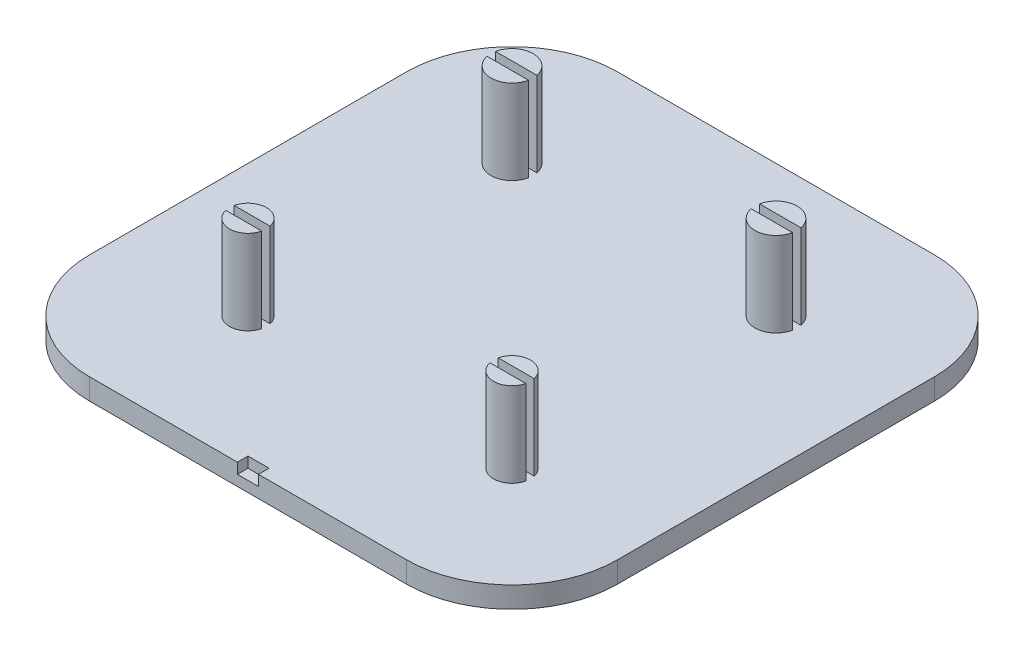
ISO-10303-21;
HEADER;
FILE_DESCRIPTION(('STEP AP214'),'2;1');
FILE_NAME('part.step','',(''),(''),'','','');
FILE_SCHEMA(('AUTOMOTIVE_DESIGN { 1 0 10303 214 1 1 1 1 }'));
ENDSEC;
DATA;
#1=APPLICATION_CONTEXT('core data for automotive mechanical design processes');
#2=APPLICATION_PROTOCOL_DEFINITION('international standard','automotive_design',2000,#1);
#3=PRODUCT_CONTEXT('',#1,'mechanical');
#4=PRODUCT('Part','Part','',(#3));
#5=PRODUCT_RELATED_PRODUCT_CATEGORY('part','',(#4));
#6=PRODUCT_DEFINITION_FORMATION('','',#4);
#7=PRODUCT_DEFINITION_CONTEXT('part definition',#1,'design');
#8=PRODUCT_DEFINITION('design','',#6,#7);
#9=PRODUCT_DEFINITION_SHAPE('','',#8);
#10=(LENGTH_UNIT() NAMED_UNIT(*) SI_UNIT(.MILLI.,.METRE.));
#11=(NAMED_UNIT(*) PLANE_ANGLE_UNIT() SI_UNIT($,.RADIAN.));
#12=(NAMED_UNIT(*) SI_UNIT($,.STERADIAN.) SOLID_ANGLE_UNIT());
#13=UNCERTAINTY_MEASURE_WITH_UNIT(LENGTH_MEASURE(1.E-05),#10,'distance_accuracy_value','');
#14=(GEOMETRIC_REPRESENTATION_CONTEXT(3) GLOBAL_UNCERTAINTY_ASSIGNED_CONTEXT((#13)) GLOBAL_UNIT_ASSIGNED_CONTEXT((#10,
#11,#12)) REPRESENTATION_CONTEXT('',''));
#15=CARTESIAN_POINT('',(0.,0.,0.));
#16=DIRECTION('',(0.,0.,1.));
#17=DIRECTION('',(1.,0.,0.));
#18=AXIS2_PLACEMENT_3D('',#15,#16,#17);
#19=CARTESIAN_POINT('',(0.,2.,0.));
#20=DIRECTION('',(0.,1.,0.));
#21=DIRECTION('',(0.,0.,1.));
#22=AXIS2_PLACEMENT_3D('',#19,#20,#21);
#23=PLANE('',#22);
#24=DIRECTION('',(1.,0.,0.));
#25=VECTOR('',#24,1.);
#26=CARTESIAN_POINT('',(0.,2.,11.4372551691158));
#27=LINE('',#26,#25);
#28=CARTESIAN_POINT('',(-193.346494385497,2.,11.4372551691158));
#29=VERTEX_POINT('',#28);
#30=CARTESIAN_POINT('',(-189.427310797044,2.,11.4372551691158));
#31=VERTEX_POINT('',#30);
#32=EDGE_CURVE('E296',#29,#31,#27,.T.);
#33=ORIENTED_EDGE('',*,*,#32,.T.);
#34=CARTESIAN_POINT('',(-191.38690259127,2.,11.0372551691158));
#35=DIRECTION('',(0.,1.,0.));
#36=DIRECTION('',(0.,0.,1.));
#37=AXIS2_PLACEMENT_3D('',#34,#35,#36);
#38=CIRCLE('',#37,2.);
#39=EDGE_CURVE('E301',#29,#31,#38,.T.);
#40=ORIENTED_EDGE('',*,*,#39,.F.);
#41=EDGE_LOOP('',(#33,#40));
#42=FACE_BOUND('',#41,.T.);
#43=CARTESIAN_POINT('',(-191.38690259127,2.,11.0372551691158));
#44=DIRECTION('',(0.,1.,0.));
#45=DIRECTION('',(0.,0.,1.));
#46=AXIS2_PLACEMENT_3D('',#43,#44,#45);
#47=CIRCLE('',#46,2.);
#48=CARTESIAN_POINT('',(-189.427310797044,2.,10.6372551691158));
#49=VERTEX_POINT('',#48);
#50=CARTESIAN_POINT('',(-193.346494385497,2.,10.6372551691158));
#51=VERTEX_POINT('',#50);
#52=EDGE_CURVE('E317',#49,#51,#47,.T.);
#53=ORIENTED_EDGE('',*,*,#52,.F.);
#54=DIRECTION('',(1.,0.,0.));
#55=VECTOR('',#54,1.);
#56=CARTESIAN_POINT('',(0.,2.,10.6372551691158));
#57=LINE('',#56,#55);
#58=EDGE_CURVE('E312',#51,#49,#57,.T.);
#59=ORIENTED_EDGE('',*,*,#58,.F.);
#60=EDGE_LOOP('',(#53,#59));
#61=FACE_BOUND('',#60,.T.);
#62=DIRECTION('',(1.,0.,0.));
#63=VECTOR('',#62,1.);
#64=CARTESIAN_POINT('',(0.,2.,36.4372551691158));
#65=LINE('',#64,#63);
#66=CARTESIAN_POINT('',(-193.09057509501,2.,36.4372551691158));
#67=VERTEX_POINT('',#66);
#68=CARTESIAN_POINT('',(-189.68323008753,2.,36.4372551691158));
#69=VERTEX_POINT('',#68);
#70=EDGE_CURVE('E373',#67,#69,#65,.T.);
#71=ORIENTED_EDGE('',*,*,#70,.T.);
#72=CARTESIAN_POINT('',(-191.38690259127,2.,36.0372551691158));
#73=DIRECTION('',(0.,1.,0.));
#74=DIRECTION('',(0.,0.,1.));
#75=AXIS2_PLACEMENT_3D('',#72,#73,#74);
#76=CIRCLE('',#75,1.75000000000001);
#77=EDGE_CURVE('E378',#67,#69,#76,.T.);
#78=ORIENTED_EDGE('',*,*,#77,.F.);
#79=EDGE_LOOP('',(#71,#78));
#80=FACE_BOUND('',#79,.T.);
#81=CARTESIAN_POINT('',(-191.38690259127,2.,36.0372551691158));
#82=DIRECTION('',(0.,1.,0.));
#83=DIRECTION('',(0.,0.,1.));
#84=AXIS2_PLACEMENT_3D('',#81,#82,#83);
#85=CIRCLE('',#84,1.75000000000001);
#86=CARTESIAN_POINT('',(-189.68323008753,2.,35.6372551691158));
#87=VERTEX_POINT('',#86);
#88=CARTESIAN_POINT('',(-193.09057509501,2.,35.6372551691158));
#89=VERTEX_POINT('',#88);
#90=EDGE_CURVE('E363',#87,#89,#85,.T.);
#91=ORIENTED_EDGE('',*,*,#90,.F.);
#92=DIRECTION('',(1.,0.,0.));
#93=VECTOR('',#92,1.);
#94=CARTESIAN_POINT('',(0.,2.,35.6372551691158));
#95=LINE('',#94,#93);
#96=EDGE_CURVE('E358',#89,#87,#95,.T.);
#97=ORIENTED_EDGE('',*,*,#96,.F.);
#98=EDGE_LOOP('',(#91,#97));
#99=FACE_BOUND('',#98,.T.);
#100=CARTESIAN_POINT('',(-166.38690259127,2.,36.0372551691158));
#101=DIRECTION('',(0.,1.,0.));
#102=DIRECTION('',(0.,0.,1.));
#103=AXIS2_PLACEMENT_3D('',#100,#101,#102);
#104=CIRCLE('',#103,1.75000000000001);
#105=CARTESIAN_POINT('',(-164.68323008753,2.,35.6372551691158));
#106=VERTEX_POINT('',#105);
#107=CARTESIAN_POINT('',(-168.09057509501,2.,35.6372551691158));
#108=VERTEX_POINT('',#107);
#109=EDGE_CURVE('E348',#106,#108,#104,.T.);
#110=ORIENTED_EDGE('',*,*,#109,.F.);
#111=DIRECTION('',(1.,0.,0.));
#112=VECTOR('',#111,1.);
#113=CARTESIAN_POINT('',(0.,2.,35.6372551691158));
#114=LINE('',#113,#112);
#115=EDGE_CURVE('E343',#108,#106,#114,.T.);
#116=ORIENTED_EDGE('',*,*,#115,.F.);
#117=EDGE_LOOP('',(#110,#116));
#118=FACE_BOUND('',#117,.T.);
#119=DIRECTION('',(1.,0.,0.));
#120=VECTOR('',#119,1.);
#121=CARTESIAN_POINT('',(0.,2.,36.4372551691158));
#122=LINE('',#121,#120);
#123=CARTESIAN_POINT('',(-168.09057509501,2.,36.4372551691158));
#124=VERTEX_POINT('',#123);
#125=CARTESIAN_POINT('',(-164.68323008753,2.,36.4372551691158));
#126=VERTEX_POINT('',#125);
#127=EDGE_CURVE('E327',#124,#126,#122,.T.);
#128=ORIENTED_EDGE('',*,*,#127,.T.);
#129=CARTESIAN_POINT('',(-166.38690259127,2.,36.0372551691158));
#130=DIRECTION('',(0.,1.,0.));
#131=DIRECTION('',(0.,0.,1.));
#132=AXIS2_PLACEMENT_3D('',#129,#130,#131);
#133=CIRCLE('',#132,1.75000000000001);
#134=EDGE_CURVE('E332',#124,#126,#133,.T.);
#135=ORIENTED_EDGE('',*,*,#134,.F.);
#136=EDGE_LOOP('',(#128,#135));
#137=FACE_BOUND('',#136,.T.);
#138=CARTESIAN_POINT('',(-166.38690259127,2.,11.0372551691158));
#139=DIRECTION('',(0.,1.,0.));
#140=DIRECTION('',(0.,0.,1.));
#141=AXIS2_PLACEMENT_3D('',#138,#139,#140);
#142=CIRCLE('',#141,2.);
#143=CARTESIAN_POINT('',(-164.427310797044,2.,10.6372551691158));
#144=VERTEX_POINT('',#143);
#145=CARTESIAN_POINT('',(-168.346494385497,2.,10.6372551691158));
#146=VERTEX_POINT('',#145);
#147=EDGE_CURVE('E286',#144,#146,#142,.T.);
#148=ORIENTED_EDGE('',*,*,#147,.F.);
#149=DIRECTION('',(1.,0.,0.));
#150=VECTOR('',#149,1.);
#151=CARTESIAN_POINT('',(0.,2.,10.6372551691158));
#152=LINE('',#151,#150);
#153=EDGE_CURVE('E281',#146,#144,#152,.T.);
#154=ORIENTED_EDGE('',*,*,#153,.F.);
#155=EDGE_LOOP('',(#148,#154));
#156=FACE_BOUND('',#155,.T.);
#157=DIRECTION('',(1.,0.,0.));
#158=VECTOR('',#157,1.);
#159=CARTESIAN_POINT('',(0.,2.,11.4372551691158));
#160=LINE('',#159,#158);
#161=CARTESIAN_POINT('',(-168.346494385497,2.,11.4372551691158));
#162=VERTEX_POINT('',#161);
#163=CARTESIAN_POINT('',(-164.427310797044,2.,11.4372551691158));
#164=VERTEX_POINT('',#163);
#165=EDGE_CURVE('E261',#162,#164,#160,.T.);
#166=ORIENTED_EDGE('',*,*,#165,.T.);
#167=CARTESIAN_POINT('',(-166.38690259127,2.,11.0372551691158));
#168=DIRECTION('',(0.,1.,0.));
#169=DIRECTION('',(0.,0.,1.));
#170=AXIS2_PLACEMENT_3D('',#167,#168,#169);
#171=CIRCLE('',#170,2.);
#172=EDGE_CURVE('E270',#162,#164,#171,.T.);
#173=ORIENTED_EDGE('',*,*,#172,.F.);
#174=EDGE_LOOP('',(#166,#173));
#175=FACE_BOUND('',#174,.T.);
#176=DIRECTION('',(1.,0.,0.));
#177=VECTOR('',#176,1.);
#178=CARTESIAN_POINT('',(0.,2.,47.5372551691158));
#179=LINE('',#178,#177);
#180=CARTESIAN_POINT('',(-179.88690259127,2.,47.5372551691158));
#181=VERTEX_POINT('',#180);
#182=CARTESIAN_POINT('',(-177.88690259127,2.,47.5372551691158));
#183=VERTEX_POINT('',#182);
#184=EDGE_CURVE('E252',#181,#183,#179,.T.);
#185=ORIENTED_EDGE('',*,*,#184,.T.);
#186=DIRECTION('',(0.,0.,1.));
#187=VECTOR('',#186,1.);
#188=CARTESIAN_POINT('',(-177.88690259127,2.,0.));
#189=LINE('',#188,#187);
#190=CARTESIAN_POINT('',(-177.88690259127,2.,48.5372551691158));
#191=VERTEX_POINT('',#190);
#192=EDGE_CURVE('E243',#183,#191,#189,.T.);
#193=ORIENTED_EDGE('',*,*,#192,.T.);
#194=DIRECTION('',(1.,0.,0.));
#195=VECTOR('',#194,1.);
#196=CARTESIAN_POINT('',(-203.88690259127,2.,48.5372551691158));
#197=LINE('',#196,#195);
#198=CARTESIAN_POINT('',(-163.88690259127,2.,48.5372551691158));
#199=VERTEX_POINT('',#198);
#200=EDGE_CURVE('E69',#191,#199,#197,.T.);
#201=ORIENTED_EDGE('',*,*,#200,.T.);
#202=CARTESIAN_POINT('',(-163.88690259127,2.,38.5372551691158));
#203=DIRECTION('',(0.,1.,0.));
#204=DIRECTION('',(0.,0.,1.));
#205=AXIS2_PLACEMENT_3D('',#202,#203,#204);
#206=CIRCLE('',#205,10.);
#207=CARTESIAN_POINT('',(-153.88690259127,2.,38.5372551691158));
#208=VERTEX_POINT('',#207);
#209=EDGE_CURVE('E435',#199,#208,#206,.T.);
#210=ORIENTED_EDGE('',*,*,#209,.T.);
#211=DIRECTION('',(0.,0.,-1.));
#212=VECTOR('',#211,1.);
#213=CARTESIAN_POINT('',(-153.88690259127,2.,-1.4627448308842));
#214=LINE('',#213,#212);
#215=CARTESIAN_POINT('',(-153.88690259127,2.,8.5372551691158));
#216=VERTEX_POINT('',#215);
#217=EDGE_CURVE('E397',#208,#216,#214,.T.);
#218=ORIENTED_EDGE('',*,*,#217,.T.);
#219=CARTESIAN_POINT('',(-163.88690259127,2.,8.5372551691158));
#220=DIRECTION('',(0.,1.,0.));
#221=DIRECTION('',(0.,0.,1.));
#222=AXIS2_PLACEMENT_3D('',#219,#220,#221);
#223=CIRCLE('',#222,10.);
#224=CARTESIAN_POINT('',(-163.88690259127,2.,-1.4627448308842));
#225=VERTEX_POINT('',#224);
#226=EDGE_CURVE('E437',#216,#225,#223,.T.);
#227=ORIENTED_EDGE('',*,*,#226,.T.);
#228=DIRECTION('',(-1.,0.,0.));
#229=VECTOR('',#228,1.);
#230=CARTESIAN_POINT('',(-203.88690259127,2.,-1.4627448308842));
#231=LINE('',#230,#229);
#232=CARTESIAN_POINT('',(-193.88690259127,2.,-1.4627448308842));
#233=VERTEX_POINT('',#232);
#234=EDGE_CURVE('E400',#225,#233,#231,.T.);
#235=ORIENTED_EDGE('',*,*,#234,.T.);
#236=CARTESIAN_POINT('',(-193.88690259127,2.,8.5372551691158));
#237=DIRECTION('',(0.,1.,0.));
#238=DIRECTION('',(0.,0.,1.));
#239=AXIS2_PLACEMENT_3D('',#236,#237,#238);
#240=CIRCLE('',#239,10.);
#241=CARTESIAN_POINT('',(-203.88690259127,2.,8.5372551691158));
#242=VERTEX_POINT('',#241);
#243=EDGE_CURVE('E431',#233,#242,#240,.T.);
#244=ORIENTED_EDGE('',*,*,#243,.T.);
#245=DIRECTION('',(0.,0.,1.));
#246=VECTOR('',#245,1.);
#247=CARTESIAN_POINT('',(-203.88690259127,2.,-1.4627448308842));
#248=LINE('',#247,#246);
#249=CARTESIAN_POINT('',(-203.88690259127,2.,38.5372551691158));
#250=VERTEX_POINT('',#249);
#251=EDGE_CURVE('E390',#242,#250,#248,.T.);
#252=ORIENTED_EDGE('',*,*,#251,.T.);
#253=CARTESIAN_POINT('',(-193.88690259127,2.,38.5372551691158));
#254=DIRECTION('',(0.,1.,0.));
#255=DIRECTION('',(0.,0.,1.));
#256=AXIS2_PLACEMENT_3D('',#253,#254,#255);
#257=CIRCLE('',#256,10.);
#258=CARTESIAN_POINT('',(-193.88690259127,2.,48.5372551691158));
#259=VERTEX_POINT('',#258);
#260=EDGE_CURVE('E433',#250,#259,#257,.T.);
#261=ORIENTED_EDGE('',*,*,#260,.T.);
#262=CARTESIAN_POINT('',(-179.88690259127,2.,48.5372551691158));
#263=VERTEX_POINT('',#262);
#264=EDGE_CURVE('E394',#259,#263,#197,.T.);
#265=ORIENTED_EDGE('',*,*,#264,.T.);
#266=DIRECTION('',(0.,0.,1.));
#267=VECTOR('',#266,1.);
#268=CARTESIAN_POINT('',(-179.88690259127,2.,0.));
#269=LINE('',#268,#267);
#270=EDGE_CURVE('E250',#181,#263,#269,.T.);
#271=ORIENTED_EDGE('',*,*,#270,.F.);
#272=EDGE_LOOP('',(#185,#193,#201,#210,#218,#227,#235,#244,#252,#261,#265,#271));
#273=FACE_BOUND('',#272,.T.);
#274=ADVANCED_FACE('F46',(#42,#61,#80,#99,#118,#137,#156,#175,#273),#23,.T.);
#275=CARTESIAN_POINT('',(-203.88690259127,2.,48.5372551691158));
#276=DIRECTION('',(0.,0.,-1.));
#277=DIRECTION('',(-1.,0.,0.));
#278=AXIS2_PLACEMENT_3D('',#275,#276,#277);
#279=PLANE('',#278);
#280=DIRECTION('',(0.,1.,0.));
#281=VECTOR('',#280,1.);
#282=CARTESIAN_POINT('',(-177.88690259127,1.,48.5372551691158));
#283=LINE('',#282,#281);
#284=CARTESIAN_POINT('',(-177.88690259127,1.,48.5372551691158));
#285=VERTEX_POINT('',#284);
#286=EDGE_CURVE('E259',#285,#191,#283,.T.);
#287=ORIENTED_EDGE('',*,*,#286,.F.);
#288=DIRECTION('',(1.,0.,0.));
#289=VECTOR('',#288,1.);
#290=CARTESIAN_POINT('',(0.,1.,48.5372551691158));
#291=LINE('',#290,#289);
#292=CARTESIAN_POINT('',(-179.88690259127,1.,48.5372551691158));
#293=VERTEX_POINT('',#292);
#294=EDGE_CURVE('E245',#293,#285,#291,.T.);
#295=ORIENTED_EDGE('',*,*,#294,.F.);
#296=DIRECTION('',(0.,1.,0.));
#297=VECTOR('',#296,1.);
#298=CARTESIAN_POINT('',(-179.88690259127,1.,48.5372551691158));
#299=LINE('',#298,#297);
#300=EDGE_CURVE('E262',#293,#263,#299,.T.);
#301=ORIENTED_EDGE('',*,*,#300,.T.);
#302=ORIENTED_EDGE('',*,*,#264,.F.);
#303=DIRECTION('',(0.,-1.,0.));
#304=VECTOR('',#303,1.);
#305=CARTESIAN_POINT('',(-193.88690259127,2.,48.5372551691158));
#306=LINE('',#305,#304);
#307=CARTESIAN_POINT('',(-193.88690259127,0.,48.5372551691158));
#308=VERTEX_POINT('',#307);
#309=EDGE_CURVE('E439',#259,#308,#306,.T.);
#310=ORIENTED_EDGE('',*,*,#309,.T.);
#311=DIRECTION('',(1.,0.,0.));
#312=VECTOR('',#311,1.);
#313=CARTESIAN_POINT('',(-203.88690259127,0.,48.5372551691158));
#314=LINE('',#313,#312);
#315=CARTESIAN_POINT('',(-163.88690259127,0.,48.5372551691158));
#316=VERTEX_POINT('',#315);
#317=EDGE_CURVE('E406',#308,#316,#314,.T.);
#318=ORIENTED_EDGE('',*,*,#317,.T.);
#319=DIRECTION('',(0.,-1.,0.));
#320=VECTOR('',#319,1.);
#321=CARTESIAN_POINT('',(-163.88690259127,2.,48.5372551691158));
#322=LINE('',#321,#320);
#323=EDGE_CURVE('E442',#316,#199,#322,.F.);
#324=ORIENTED_EDGE('',*,*,#323,.T.);
#325=ORIENTED_EDGE('',*,*,#200,.F.);
#326=EDGE_LOOP('',(#287,#295,#301,#302,#310,#318,#324,#325));
#327=FACE_BOUND('',#326,.T.);
#328=ADVANCED_FACE('F462',(#327),#279,.F.);
#329=CARTESIAN_POINT('',(-203.88690259127,2.,-1.4627448308842));
#330=DIRECTION('',(1.,0.,0.));
#331=DIRECTION('',(0.,0.,-1.));
#332=AXIS2_PLACEMENT_3D('',#329,#330,#331);
#333=PLANE('',#332);
#334=DIRECTION('',(0.,0.,1.));
#335=VECTOR('',#334,1.);
#336=CARTESIAN_POINT('',(-203.88690259127,0.,-1.4627448308842));
#337=LINE('',#336,#335);
#338=CARTESIAN_POINT('',(-203.88690259127,0.,8.5372551691158));
#339=VERTEX_POINT('',#338);
#340=CARTESIAN_POINT('',(-203.88690259127,0.,38.5372551691158));
#341=VERTEX_POINT('',#340);
#342=EDGE_CURVE('E389',#339,#341,#337,.T.);
#343=ORIENTED_EDGE('',*,*,#342,.T.);
#344=DIRECTION('',(0.,-1.,0.));
#345=VECTOR('',#344,1.);
#346=CARTESIAN_POINT('',(-203.88690259127,2.,38.5372551691158));
#347=LINE('',#346,#345);
#348=EDGE_CURVE('E11',#341,#250,#347,.F.);
#349=ORIENTED_EDGE('',*,*,#348,.T.);
#350=ORIENTED_EDGE('',*,*,#251,.F.);
#351=DIRECTION('',(0.,-1.,0.));
#352=VECTOR('',#351,1.);
#353=CARTESIAN_POINT('',(-203.88690259127,2.,8.5372551691158));
#354=LINE('',#353,#352);
#355=EDGE_CURVE('E54',#242,#339,#354,.T.);
#356=ORIENTED_EDGE('',*,*,#355,.T.);
#357=EDGE_LOOP('',(#343,#349,#350,#356));
#358=FACE_BOUND('',#357,.T.);
#359=ADVANCED_FACE('F448',(#358),#333,.F.);
#360=CARTESIAN_POINT('',(-153.88690259127,2.,-1.4627448308842));
#361=DIRECTION('',(-1.,0.,0.));
#362=DIRECTION('',(0.,0.,1.));
#363=AXIS2_PLACEMENT_3D('',#360,#361,#362);
#364=PLANE('',#363);
#365=DIRECTION('',(0.,0.,-1.));
#366=VECTOR('',#365,1.);
#367=CARTESIAN_POINT('',(-153.88690259127,0.,-1.4627448308842));
#368=LINE('',#367,#366);
#369=CARTESIAN_POINT('',(-153.88690259127,0.,38.5372551691158));
#370=VERTEX_POINT('',#369);
#371=CARTESIAN_POINT('',(-153.88690259127,0.,8.5372551691158));
#372=VERTEX_POINT('',#371);
#373=EDGE_CURVE('E409',#370,#372,#368,.T.);
#374=ORIENTED_EDGE('',*,*,#373,.T.);
#375=DIRECTION('',(0.,-1.,0.));
#376=VECTOR('',#375,1.);
#377=CARTESIAN_POINT('',(-153.88690259127,2.,8.5372551691158));
#378=LINE('',#377,#376);
#379=EDGE_CURVE('E429',#372,#216,#378,.F.);
#380=ORIENTED_EDGE('',*,*,#379,.T.);
#381=ORIENTED_EDGE('',*,*,#217,.F.);
#382=DIRECTION('',(0.,-1.,0.));
#383=VECTOR('',#382,1.);
#384=CARTESIAN_POINT('',(-153.88690259127,2.,38.5372551691158));
#385=LINE('',#384,#383);
#386=EDGE_CURVE('E426',#208,#370,#385,.T.);
#387=ORIENTED_EDGE('',*,*,#386,.T.);
#388=EDGE_LOOP('',(#374,#380,#381,#387));
#389=FACE_BOUND('',#388,.T.);
#390=ADVANCED_FACE('F474',(#389),#364,.F.);
#391=CARTESIAN_POINT('',(-203.88690259127,2.,-1.4627448308842));
#392=DIRECTION('',(0.,0.,1.));
#393=DIRECTION('',(1.,0.,0.));
#394=AXIS2_PLACEMENT_3D('',#391,#392,#393);
#395=PLANE('',#394);
#396=ORIENTED_EDGE('',*,*,#234,.F.);
#397=DIRECTION('',(0.,-1.,0.));
#398=VECTOR('',#397,1.);
#399=CARTESIAN_POINT('',(-163.88690259127,2.,-1.4627448308842));
#400=LINE('',#399,#398);
#401=CARTESIAN_POINT('',(-163.88690259127,0.,-1.4627448308842));
#402=VERTEX_POINT('',#401);
#403=EDGE_CURVE('E415',#225,#402,#400,.T.);
#404=ORIENTED_EDGE('',*,*,#403,.T.);
#405=DIRECTION('',(-1.,0.,0.));
#406=VECTOR('',#405,1.);
#407=CARTESIAN_POINT('',(-203.88690259127,0.,-1.4627448308842));
#408=LINE('',#407,#406);
#409=CARTESIAN_POINT('',(-193.88690259127,0.,-1.4627448308842));
#410=VERTEX_POINT('',#409);
#411=EDGE_CURVE('E393',#402,#410,#408,.T.);
#412=ORIENTED_EDGE('',*,*,#411,.T.);
#413=DIRECTION('',(0.,-1.,0.));
#414=VECTOR('',#413,1.);
#415=CARTESIAN_POINT('',(-193.88690259127,2.,-1.4627448308842));
#416=LINE('',#415,#414);
#417=EDGE_CURVE('E403',#410,#233,#416,.F.);
#418=ORIENTED_EDGE('',*,*,#417,.T.);
#419=EDGE_LOOP('',(#396,#404,#412,#418));
#420=FACE_BOUND('',#419,.T.);
#421=ADVANCED_FACE('F468',(#420),#395,.F.);
#422=CARTESIAN_POINT('',(0.,0.,0.));
#423=DIRECTION('',(0.,1.,0.));
#424=DIRECTION('',(0.,0.,1.));
#425=AXIS2_PLACEMENT_3D('',#422,#423,#424);
#426=PLANE('',#425);
#427=ORIENTED_EDGE('',*,*,#411,.F.);
#428=CARTESIAN_POINT('',(-163.88690259127,0.,8.5372551691158));
#429=DIRECTION('',(0.,1.,0.));
#430=DIRECTION('',(0.,0.,1.));
#431=AXIS2_PLACEMENT_3D('',#428,#429,#430);
#432=CIRCLE('',#431,10.);
#433=EDGE_CURVE('E424',#402,#372,#432,.F.);
#434=ORIENTED_EDGE('',*,*,#433,.T.);
#435=ORIENTED_EDGE('',*,*,#373,.F.);
#436=CARTESIAN_POINT('',(-163.88690259127,0.,38.5372551691158));
#437=DIRECTION('',(0.,1.,0.));
#438=DIRECTION('',(0.,0.,1.));
#439=AXIS2_PLACEMENT_3D('',#436,#437,#438);
#440=CIRCLE('',#439,10.);
#441=EDGE_CURVE('E422',#370,#316,#440,.F.);
#442=ORIENTED_EDGE('',*,*,#441,.T.);
#443=ORIENTED_EDGE('',*,*,#317,.F.);
#444=CARTESIAN_POINT('',(-193.88690259127,0.,38.5372551691158));
#445=DIRECTION('',(0.,1.,0.));
#446=DIRECTION('',(0.,0.,1.));
#447=AXIS2_PLACEMENT_3D('',#444,#445,#446);
#448=CIRCLE('',#447,10.);
#449=EDGE_CURVE('E420',#308,#341,#448,.F.);
#450=ORIENTED_EDGE('',*,*,#449,.T.);
#451=ORIENTED_EDGE('',*,*,#342,.F.);
#452=CARTESIAN_POINT('',(-193.88690259127,0.,8.5372551691158));
#453=DIRECTION('',(0.,1.,0.));
#454=DIRECTION('',(0.,0.,1.));
#455=AXIS2_PLACEMENT_3D('',#452,#453,#454);
#456=CIRCLE('',#455,10.);
#457=EDGE_CURVE('E418',#339,#410,#456,.F.);
#458=ORIENTED_EDGE('',*,*,#457,.T.);
#459=EDGE_LOOP('',(#427,#434,#435,#442,#443,#450,#451,#458));
#460=FACE_BOUND('',#459,.T.);
#461=ADVANCED_FACE('F454',(#460),#426,.F.);
#462=CARTESIAN_POINT('',(0.,10.,36.4372551691158));
#463=DIRECTION('',(0.,0.,-1.));
#464=DIRECTION('',(-1.,0.,0.));
#465=AXIS2_PLACEMENT_3D('',#462,#463,#464);
#466=PLANE('',#465);
#467=ORIENTED_EDGE('',*,*,#70,.F.);
#468=DIRECTION('',(0.,-1.,0.));
#469=VECTOR('',#468,1.);
#470=CARTESIAN_POINT('',(-193.09057509501,10.,36.4372551691158));
#471=LINE('',#470,#469);
#472=CARTESIAN_POINT('',(-193.09057509501,10.,36.4372551691158));
#473=VERTEX_POINT('',#472);
#474=EDGE_CURVE('E386',#473,#67,#471,.T.);
#475=ORIENTED_EDGE('',*,*,#474,.F.);
#476=DIRECTION('',(1.,0.,0.));
#477=VECTOR('',#476,1.);
#478=CARTESIAN_POINT('',(0.,10.,36.4372551691158));
#479=LINE('',#478,#477);
#480=CARTESIAN_POINT('',(-189.68323008753,10.,36.4372551691158));
#481=VERTEX_POINT('',#480);
#482=EDGE_CURVE('E374',#473,#481,#479,.T.);
#483=ORIENTED_EDGE('',*,*,#482,.T.);
#484=DIRECTION('',(0.,-1.,0.));
#485=VECTOR('',#484,1.);
#486=CARTESIAN_POINT('',(-189.68323008753,10.,36.4372551691158));
#487=LINE('',#486,#485);
#488=EDGE_CURVE('E380',#481,#69,#487,.T.);
#489=ORIENTED_EDGE('',*,*,#488,.T.);
#490=EDGE_LOOP('',(#467,#475,#483,#489));
#491=FACE_BOUND('',#490,.T.);
#492=ADVANCED_FACE('F501',(#491),#466,.T.);
#493=CARTESIAN_POINT('',(-191.38690259127,10.,36.0372551691158));
#494=DIRECTION('',(0.,-1.,0.));
#495=DIRECTION('',(0.,0.,-1.));
#496=AXIS2_PLACEMENT_3D('',#493,#494,#495);
#497=CYLINDRICAL_SURFACE('',#496,1.75000000000001);
#498=ORIENTED_EDGE('',*,*,#77,.T.);
#499=ORIENTED_EDGE('',*,*,#488,.F.);
#500=CARTESIAN_POINT('',(-191.38690259127,10.,36.0372551691158));
#501=DIRECTION('',(0.,1.,0.));
#502=DIRECTION('',(0.,0.,1.));
#503=AXIS2_PLACEMENT_3D('',#500,#501,#502);
#504=CIRCLE('',#503,1.75000000000001);
#505=EDGE_CURVE('E377',#473,#481,#504,.T.);
#506=ORIENTED_EDGE('',*,*,#505,.F.);
#507=ORIENTED_EDGE('',*,*,#474,.T.);
#508=EDGE_LOOP('',(#498,#499,#506,#507));
#509=FACE_BOUND('',#508,.T.);
#510=ADVANCED_FACE('F691',(#509),#497,.T.);
#511=CARTESIAN_POINT('',(0.,10.,0.));
#512=DIRECTION('',(0.,1.,0.));
#513=DIRECTION('',(0.,0.,1.));
#514=AXIS2_PLACEMENT_3D('',#511,#512,#513);
#515=PLANE('',#514);
#516=ORIENTED_EDGE('',*,*,#482,.F.);
#517=ORIENTED_EDGE('',*,*,#505,.T.);
#518=EDGE_LOOP('',(#516,#517));
#519=FACE_BOUND('',#518,.T.);
#520=ADVANCED_FACE('F688',(#519),#515,.T.);
#521=CARTESIAN_POINT('',(0.,10.,35.6372551691158));
#522=DIRECTION('',(0.,0.,-1.));
#523=DIRECTION('',(-1.,0.,0.));
#524=AXIS2_PLACEMENT_3D('',#521,#522,#523);
#525=PLANE('',#524);
#526=ORIENTED_EDGE('',*,*,#96,.T.);
#527=DIRECTION('',(0.,-1.,0.));
#528=VECTOR('',#527,1.);
#529=CARTESIAN_POINT('',(-189.68323008753,10.,35.6372551691158));
#530=LINE('',#529,#528);
#531=CARTESIAN_POINT('',(-189.68323008753,10.,35.6372551691158));
#532=VERTEX_POINT('',#531);
#533=EDGE_CURVE('E370',#532,#87,#530,.T.);
#534=ORIENTED_EDGE('',*,*,#533,.F.);
#535=DIRECTION('',(1.,0.,0.));
#536=VECTOR('',#535,1.);
#537=CARTESIAN_POINT('',(0.,10.,35.6372551691158));
#538=LINE('',#537,#536);
#539=CARTESIAN_POINT('',(-193.09057509501,10.,35.6372551691158));
#540=VERTEX_POINT('',#539);
#541=EDGE_CURVE('E359',#540,#532,#538,.T.);
#542=ORIENTED_EDGE('',*,*,#541,.F.);
#543=DIRECTION('',(0.,-1.,0.));
#544=VECTOR('',#543,1.);
#545=CARTESIAN_POINT('',(-193.09057509501,10.,35.6372551691158));
#546=LINE('',#545,#544);
#547=EDGE_CURVE('E365',#540,#89,#546,.T.);
#548=ORIENTED_EDGE('',*,*,#547,.T.);
#549=EDGE_LOOP('',(#526,#534,#542,#548));
#550=FACE_BOUND('',#549,.T.);
#551=ADVANCED_FACE('F684',(#550),#525,.F.);
#552=CARTESIAN_POINT('',(-191.38690259127,10.,36.0372551691158));
#553=DIRECTION('',(0.,-1.,0.));
#554=DIRECTION('',(0.,0.,-1.));
#555=AXIS2_PLACEMENT_3D('',#552,#553,#554);
#556=CYLINDRICAL_SURFACE('',#555,1.75000000000001);
#557=ORIENTED_EDGE('',*,*,#90,.T.);
#558=ORIENTED_EDGE('',*,*,#547,.F.);
#559=CARTESIAN_POINT('',(-191.38690259127,10.,36.0372551691158));
#560=DIRECTION('',(0.,1.,0.));
#561=DIRECTION('',(0.,0.,1.));
#562=AXIS2_PLACEMENT_3D('',#559,#560,#561);
#563=CIRCLE('',#562,1.75000000000001);
#564=EDGE_CURVE('E362',#532,#540,#563,.T.);
#565=ORIENTED_EDGE('',*,*,#564,.F.);
#566=ORIENTED_EDGE('',*,*,#533,.T.);
#567=EDGE_LOOP('',(#557,#558,#565,#566));
#568=FACE_BOUND('',#567,.T.);
#569=ADVANCED_FACE('F680',(#568),#556,.T.);
#570=CARTESIAN_POINT('',(0.,10.,0.));
#571=DIRECTION('',(0.,1.,0.));
#572=DIRECTION('',(0.,0.,1.));
#573=AXIS2_PLACEMENT_3D('',#570,#571,#572);
#574=PLANE('',#573);
#575=ORIENTED_EDGE('',*,*,#541,.T.);
#576=ORIENTED_EDGE('',*,*,#564,.T.);
#577=EDGE_LOOP('',(#575,#576));
#578=FACE_BOUND('',#577,.T.);
#579=ADVANCED_FACE('F676',(#578),#574,.T.);
#580=CARTESIAN_POINT('',(0.,10.,35.6372551691158));
#581=DIRECTION('',(0.,0.,-1.));
#582=DIRECTION('',(-1.,0.,0.));
#583=AXIS2_PLACEMENT_3D('',#580,#581,#582);
#584=PLANE('',#583);
#585=ORIENTED_EDGE('',*,*,#115,.T.);
#586=DIRECTION('',(0.,-1.,0.));
#587=VECTOR('',#586,1.);
#588=CARTESIAN_POINT('',(-164.68323008753,10.,35.6372551691158));
#589=LINE('',#588,#587);
#590=CARTESIAN_POINT('',(-164.68323008753,10.,35.6372551691158));
#591=VERTEX_POINT('',#590);
#592=EDGE_CURVE('E355',#591,#106,#589,.T.);
#593=ORIENTED_EDGE('',*,*,#592,.F.);
#594=DIRECTION('',(1.,0.,0.));
#595=VECTOR('',#594,1.);
#596=CARTESIAN_POINT('',(0.,10.,35.6372551691158));
#597=LINE('',#596,#595);
#598=CARTESIAN_POINT('',(-168.09057509501,10.,35.6372551691158));
#599=VERTEX_POINT('',#598);
#600=EDGE_CURVE('E344',#599,#591,#597,.T.);
#601=ORIENTED_EDGE('',*,*,#600,.F.);
#602=DIRECTION('',(0.,-1.,0.));
#603=VECTOR('',#602,1.);
#604=CARTESIAN_POINT('',(-168.09057509501,10.,35.6372551691158));
#605=LINE('',#604,#603);
#606=EDGE_CURVE('E350',#599,#108,#605,.T.);
#607=ORIENTED_EDGE('',*,*,#606,.T.);
#608=EDGE_LOOP('',(#585,#593,#601,#607));
#609=FACE_BOUND('',#608,.T.);
#610=ADVANCED_FACE('F672',(#609),#584,.F.);
#611=CARTESIAN_POINT('',(-166.38690259127,10.,36.0372551691158));
#612=DIRECTION('',(0.,-1.,0.));
#613=DIRECTION('',(0.,0.,-1.));
#614=AXIS2_PLACEMENT_3D('',#611,#612,#613);
#615=CYLINDRICAL_SURFACE('',#614,1.75000000000001);
#616=ORIENTED_EDGE('',*,*,#109,.T.);
#617=ORIENTED_EDGE('',*,*,#606,.F.);
#618=CARTESIAN_POINT('',(-166.38690259127,10.,36.0372551691158));
#619=DIRECTION('',(0.,1.,0.));
#620=DIRECTION('',(0.,0.,1.));
#621=AXIS2_PLACEMENT_3D('',#618,#619,#620);
#622=CIRCLE('',#621,1.75000000000001);
#623=EDGE_CURVE('E347',#591,#599,#622,.T.);
#624=ORIENTED_EDGE('',*,*,#623,.F.);
#625=ORIENTED_EDGE('',*,*,#592,.T.);
#626=EDGE_LOOP('',(#616,#617,#624,#625));
#627=FACE_BOUND('',#626,.T.);
#628=ADVANCED_FACE('F668',(#627),#615,.T.);
#629=CARTESIAN_POINT('',(0.,10.,0.));
#630=DIRECTION('',(0.,1.,0.));
#631=DIRECTION('',(0.,0.,1.));
#632=AXIS2_PLACEMENT_3D('',#629,#630,#631);
#633=PLANE('',#632);
#634=ORIENTED_EDGE('',*,*,#600,.T.);
#635=ORIENTED_EDGE('',*,*,#623,.T.);
#636=EDGE_LOOP('',(#634,#635));
#637=FACE_BOUND('',#636,.T.);
#638=ADVANCED_FACE('F664',(#637),#633,.T.);
#639=CARTESIAN_POINT('',(0.,10.,36.4372551691158));
#640=DIRECTION('',(0.,0.,-1.));
#641=DIRECTION('',(-1.,0.,0.));
#642=AXIS2_PLACEMENT_3D('',#639,#640,#641);
#643=PLANE('',#642);
#644=ORIENTED_EDGE('',*,*,#127,.F.);
#645=DIRECTION('',(0.,-1.,0.));
#646=VECTOR('',#645,1.);
#647=CARTESIAN_POINT('',(-168.09057509501,10.,36.4372551691158));
#648=LINE('',#647,#646);
#649=CARTESIAN_POINT('',(-168.09057509501,10.,36.4372551691158));
#650=VERTEX_POINT('',#649);
#651=EDGE_CURVE('E340',#650,#124,#648,.T.);
#652=ORIENTED_EDGE('',*,*,#651,.F.);
#653=DIRECTION('',(1.,0.,0.));
#654=VECTOR('',#653,1.);
#655=CARTESIAN_POINT('',(0.,10.,36.4372551691158));
#656=LINE('',#655,#654);
#657=CARTESIAN_POINT('',(-164.68323008753,10.,36.4372551691158));
#658=VERTEX_POINT('',#657);
#659=EDGE_CURVE('E328',#650,#658,#656,.T.);
#660=ORIENTED_EDGE('',*,*,#659,.T.);
#661=DIRECTION('',(0.,-1.,0.));
#662=VECTOR('',#661,1.);
#663=CARTESIAN_POINT('',(-164.68323008753,10.,36.4372551691158));
#664=LINE('',#663,#662);
#665=EDGE_CURVE('E334',#658,#126,#664,.T.);
#666=ORIENTED_EDGE('',*,*,#665,.T.);
#667=EDGE_LOOP('',(#644,#652,#660,#666));
#668=FACE_BOUND('',#667,.T.);
#669=ADVANCED_FACE('F660',(#668),#643,.T.);
#670=CARTESIAN_POINT('',(-166.38690259127,10.,36.0372551691158));
#671=DIRECTION('',(0.,-1.,0.));
#672=DIRECTION('',(0.,0.,-1.));
#673=AXIS2_PLACEMENT_3D('',#670,#671,#672);
#674=CYLINDRICAL_SURFACE('',#673,1.75000000000001);
#675=ORIENTED_EDGE('',*,*,#134,.T.);
#676=ORIENTED_EDGE('',*,*,#665,.F.);
#677=CARTESIAN_POINT('',(-166.38690259127,10.,36.0372551691158));
#678=DIRECTION('',(0.,1.,0.));
#679=DIRECTION('',(0.,0.,1.));
#680=AXIS2_PLACEMENT_3D('',#677,#678,#679);
#681=CIRCLE('',#680,1.75000000000001);
#682=EDGE_CURVE('E331',#650,#658,#681,.T.);
#683=ORIENTED_EDGE('',*,*,#682,.F.);
#684=ORIENTED_EDGE('',*,*,#651,.T.);
#685=EDGE_LOOP('',(#675,#676,#683,#684));
#686=FACE_BOUND('',#685,.T.);
#687=ADVANCED_FACE('F656',(#686),#674,.T.);
#688=CARTESIAN_POINT('',(0.,10.,0.));
#689=DIRECTION('',(0.,1.,0.));
#690=DIRECTION('',(0.,0.,1.));
#691=AXIS2_PLACEMENT_3D('',#688,#689,#690);
#692=PLANE('',#691);
#693=ORIENTED_EDGE('',*,*,#659,.F.);
#694=ORIENTED_EDGE('',*,*,#682,.T.);
#695=EDGE_LOOP('',(#693,#694));
#696=FACE_BOUND('',#695,.T.);
#697=ADVANCED_FACE('F652',(#696),#692,.T.);
#698=CARTESIAN_POINT('',(0.,10.,10.6372551691158));
#699=DIRECTION('',(0.,0.,-1.));
#700=DIRECTION('',(-1.,0.,0.));
#701=AXIS2_PLACEMENT_3D('',#698,#699,#700);
#702=PLANE('',#701);
#703=ORIENTED_EDGE('',*,*,#58,.T.);
#704=DIRECTION('',(0.,-1.,0.));
#705=VECTOR('',#704,1.);
#706=CARTESIAN_POINT('',(-189.427310797044,10.,10.6372551691158));
#707=LINE('',#706,#705);
#708=CARTESIAN_POINT('',(-189.427310797044,10.,10.6372551691158));
#709=VERTEX_POINT('',#708);
#710=EDGE_CURVE('E324',#709,#49,#707,.T.);
#711=ORIENTED_EDGE('',*,*,#710,.F.);
#712=DIRECTION('',(1.,0.,0.));
#713=VECTOR('',#712,1.);
#714=CARTESIAN_POINT('',(0.,10.,10.6372551691158));
#715=LINE('',#714,#713);
#716=CARTESIAN_POINT('',(-193.346494385497,10.,10.6372551691158));
#717=VERTEX_POINT('',#716);
#718=EDGE_CURVE('E313',#717,#709,#715,.T.);
#719=ORIENTED_EDGE('',*,*,#718,.F.);
#720=DIRECTION('',(0.,-1.,0.));
#721=VECTOR('',#720,1.);
#722=CARTESIAN_POINT('',(-193.346494385497,10.,10.6372551691158));
#723=LINE('',#722,#721);
#724=EDGE_CURVE('E319',#717,#51,#723,.T.);
#725=ORIENTED_EDGE('',*,*,#724,.T.);
#726=EDGE_LOOP('',(#703,#711,#719,#725));
#727=FACE_BOUND('',#726,.T.);
#728=ADVANCED_FACE('F648',(#727),#702,.F.);
#729=CARTESIAN_POINT('',(-191.38690259127,10.,11.0372551691158));
#730=DIRECTION('',(0.,-1.,0.));
#731=DIRECTION('',(0.,0.,-1.));
#732=AXIS2_PLACEMENT_3D('',#729,#730,#731);
#733=CYLINDRICAL_SURFACE('',#732,2.);
#734=ORIENTED_EDGE('',*,*,#52,.T.);
#735=ORIENTED_EDGE('',*,*,#724,.F.);
#736=CARTESIAN_POINT('',(-191.38690259127,10.,11.0372551691158));
#737=DIRECTION('',(0.,1.,0.));
#738=DIRECTION('',(0.,0.,1.));
#739=AXIS2_PLACEMENT_3D('',#736,#737,#738);
#740=CIRCLE('',#739,2.);
#741=EDGE_CURVE('E316',#709,#717,#740,.T.);
#742=ORIENTED_EDGE('',*,*,#741,.F.);
#743=ORIENTED_EDGE('',*,*,#710,.T.);
#744=EDGE_LOOP('',(#734,#735,#742,#743));
#745=FACE_BOUND('',#744,.T.);
#746=ADVANCED_FACE('F644',(#745),#733,.T.);
#747=CARTESIAN_POINT('',(0.,10.,0.));
#748=DIRECTION('',(0.,1.,0.));
#749=DIRECTION('',(0.,0.,1.));
#750=AXIS2_PLACEMENT_3D('',#747,#748,#749);
#751=PLANE('',#750);
#752=ORIENTED_EDGE('',*,*,#718,.T.);
#753=ORIENTED_EDGE('',*,*,#741,.T.);
#754=EDGE_LOOP('',(#752,#753));
#755=FACE_BOUND('',#754,.T.);
#756=ADVANCED_FACE('F640',(#755),#751,.T.);
#757=CARTESIAN_POINT('',(0.,10.,11.4372551691158));
#758=DIRECTION('',(0.,0.,-1.));
#759=DIRECTION('',(-1.,0.,0.));
#760=AXIS2_PLACEMENT_3D('',#757,#758,#759);
#761=PLANE('',#760);
#762=ORIENTED_EDGE('',*,*,#32,.F.);
#763=DIRECTION('',(0.,-1.,0.));
#764=VECTOR('',#763,1.);
#765=CARTESIAN_POINT('',(-193.346494385497,10.,11.4372551691158));
#766=LINE('',#765,#764);
#767=CARTESIAN_POINT('',(-193.346494385497,10.,11.4372551691158));
#768=VERTEX_POINT('',#767);
#769=EDGE_CURVE('E309',#768,#29,#766,.T.);
#770=ORIENTED_EDGE('',*,*,#769,.F.);
#771=DIRECTION('',(1.,0.,0.));
#772=VECTOR('',#771,1.);
#773=CARTESIAN_POINT('',(0.,10.,11.4372551691158));
#774=LINE('',#773,#772);
#775=CARTESIAN_POINT('',(-189.427310797044,10.,11.4372551691158));
#776=VERTEX_POINT('',#775);
#777=EDGE_CURVE('E297',#768,#776,#774,.T.);
#778=ORIENTED_EDGE('',*,*,#777,.T.);
#779=DIRECTION('',(0.,-1.,0.));
#780=VECTOR('',#779,1.);
#781=CARTESIAN_POINT('',(-189.427310797044,10.,11.4372551691158));
#782=LINE('',#781,#780);
#783=EDGE_CURVE('E303',#776,#31,#782,.T.);
#784=ORIENTED_EDGE('',*,*,#783,.T.);
#785=EDGE_LOOP('',(#762,#770,#778,#784));
#786=FACE_BOUND('',#785,.T.);
#787=ADVANCED_FACE('F636',(#786),#761,.T.);
#788=CARTESIAN_POINT('',(-191.38690259127,10.,11.0372551691158));
#789=DIRECTION('',(0.,-1.,0.));
#790=DIRECTION('',(0.,0.,-1.));
#791=AXIS2_PLACEMENT_3D('',#788,#789,#790);
#792=CYLINDRICAL_SURFACE('',#791,2.);
#793=ORIENTED_EDGE('',*,*,#39,.T.);
#794=ORIENTED_EDGE('',*,*,#783,.F.);
#795=CARTESIAN_POINT('',(-191.38690259127,10.,11.0372551691158));
#796=DIRECTION('',(0.,1.,0.));
#797=DIRECTION('',(0.,0.,1.));
#798=AXIS2_PLACEMENT_3D('',#795,#796,#797);
#799=CIRCLE('',#798,2.);
#800=EDGE_CURVE('E300',#768,#776,#799,.T.);
#801=ORIENTED_EDGE('',*,*,#800,.F.);
#802=ORIENTED_EDGE('',*,*,#769,.T.);
#803=EDGE_LOOP('',(#793,#794,#801,#802));
#804=FACE_BOUND('',#803,.T.);
#805=ADVANCED_FACE('F632',(#804),#792,.T.);
#806=CARTESIAN_POINT('',(0.,10.,0.));
#807=DIRECTION('',(0.,1.,0.));
#808=DIRECTION('',(0.,0.,1.));
#809=AXIS2_PLACEMENT_3D('',#806,#807,#808);
#810=PLANE('',#809);
#811=ORIENTED_EDGE('',*,*,#777,.F.);
#812=ORIENTED_EDGE('',*,*,#800,.T.);
#813=EDGE_LOOP('',(#811,#812));
#814=FACE_BOUND('',#813,.T.);
#815=ADVANCED_FACE('F628',(#814),#810,.T.);
#816=CARTESIAN_POINT('',(0.,10.,10.6372551691158));
#817=DIRECTION('',(0.,0.,-1.));
#818=DIRECTION('',(-1.,0.,0.));
#819=AXIS2_PLACEMENT_3D('',#816,#817,#818);
#820=PLANE('',#819);
#821=ORIENTED_EDGE('',*,*,#153,.T.);
#822=DIRECTION('',(0.,-1.,0.));
#823=VECTOR('',#822,1.);
#824=CARTESIAN_POINT('',(-164.427310797044,10.,10.6372551691158));
#825=LINE('',#824,#823);
#826=CARTESIAN_POINT('',(-164.427310797044,10.,10.6372551691158));
#827=VERTEX_POINT('',#826);
#828=EDGE_CURVE('E293',#827,#144,#825,.T.);
#829=ORIENTED_EDGE('',*,*,#828,.F.);
#830=DIRECTION('',(1.,0.,0.));
#831=VECTOR('',#830,1.);
#832=CARTESIAN_POINT('',(0.,10.,10.6372551691158));
#833=LINE('',#832,#831);
#834=CARTESIAN_POINT('',(-168.346494385497,10.,10.6372551691158));
#835=VERTEX_POINT('',#834);
#836=EDGE_CURVE('E282',#835,#827,#833,.T.);
#837=ORIENTED_EDGE('',*,*,#836,.F.);
#838=DIRECTION('',(0.,-1.,0.));
#839=VECTOR('',#838,1.);
#840=CARTESIAN_POINT('',(-168.346494385497,10.,10.6372551691158));
#841=LINE('',#840,#839);
#842=EDGE_CURVE('E288',#835,#146,#841,.T.);
#843=ORIENTED_EDGE('',*,*,#842,.T.);
#844=EDGE_LOOP('',(#821,#829,#837,#843));
#845=FACE_BOUND('',#844,.T.);
#846=ADVANCED_FACE('F624',(#845),#820,.F.);
#847=CARTESIAN_POINT('',(-166.38690259127,10.,11.0372551691158));
#848=DIRECTION('',(0.,-1.,0.));
#849=DIRECTION('',(0.,0.,-1.));
#850=AXIS2_PLACEMENT_3D('',#847,#848,#849);
#851=CYLINDRICAL_SURFACE('',#850,2.);
#852=ORIENTED_EDGE('',*,*,#147,.T.);
#853=ORIENTED_EDGE('',*,*,#842,.F.);
#854=CARTESIAN_POINT('',(-166.38690259127,10.,11.0372551691158));
#855=DIRECTION('',(0.,1.,0.));
#856=DIRECTION('',(0.,0.,1.));
#857=AXIS2_PLACEMENT_3D('',#854,#855,#856);
#858=CIRCLE('',#857,2.);
#859=EDGE_CURVE('E285',#827,#835,#858,.T.);
#860=ORIENTED_EDGE('',*,*,#859,.F.);
#861=ORIENTED_EDGE('',*,*,#828,.T.);
#862=EDGE_LOOP('',(#852,#853,#860,#861));
#863=FACE_BOUND('',#862,.T.);
#864=ADVANCED_FACE('F620',(#863),#851,.T.);
#865=CARTESIAN_POINT('',(0.,10.,0.));
#866=DIRECTION('',(0.,1.,0.));
#867=DIRECTION('',(0.,0.,1.));
#868=AXIS2_PLACEMENT_3D('',#865,#866,#867);
#869=PLANE('',#868);
#870=ORIENTED_EDGE('',*,*,#836,.T.);
#871=ORIENTED_EDGE('',*,*,#859,.T.);
#872=EDGE_LOOP('',(#870,#871));
#873=FACE_BOUND('',#872,.T.);
#874=ADVANCED_FACE('F616',(#873),#869,.T.);
#875=CARTESIAN_POINT('',(0.,10.,11.4372551691158));
#876=DIRECTION('',(0.,0.,-1.));
#877=DIRECTION('',(-1.,0.,0.));
#878=AXIS2_PLACEMENT_3D('',#875,#876,#877);
#879=PLANE('',#878);
#880=ORIENTED_EDGE('',*,*,#165,.F.);
#881=DIRECTION('',(0.,-1.,0.));
#882=VECTOR('',#881,1.);
#883=CARTESIAN_POINT('',(-168.346494385497,10.,11.4372551691158));
#884=LINE('',#883,#882);
#885=CARTESIAN_POINT('',(-168.346494385497,10.,11.4372551691158));
#886=VERTEX_POINT('',#885);
#887=EDGE_CURVE('E278',#886,#162,#884,.T.);
#888=ORIENTED_EDGE('',*,*,#887,.F.);
#889=DIRECTION('',(1.,0.,0.));
#890=VECTOR('',#889,1.);
#891=CARTESIAN_POINT('',(0.,10.,11.4372551691158));
#892=LINE('',#891,#890);
#893=CARTESIAN_POINT('',(-164.427310797044,10.,11.4372551691158));
#894=VERTEX_POINT('',#893);
#895=EDGE_CURVE('E266',#886,#894,#892,.T.);
#896=ORIENTED_EDGE('',*,*,#895,.T.);
#897=DIRECTION('',(0.,-1.,0.));
#898=VECTOR('',#897,1.);
#899=CARTESIAN_POINT('',(-164.427310797044,10.,11.4372551691158));
#900=LINE('',#899,#898);
#901=EDGE_CURVE('E272',#894,#164,#900,.T.);
#902=ORIENTED_EDGE('',*,*,#901,.T.);
#903=EDGE_LOOP('',(#880,#888,#896,#902));
#904=FACE_BOUND('',#903,.T.);
#905=ADVANCED_FACE('F612',(#904),#879,.T.);
#906=CARTESIAN_POINT('',(-166.38690259127,10.,11.0372551691158));
#907=DIRECTION('',(0.,-1.,0.));
#908=DIRECTION('',(0.,0.,-1.));
#909=AXIS2_PLACEMENT_3D('',#906,#907,#908);
#910=CYLINDRICAL_SURFACE('',#909,2.);
#911=ORIENTED_EDGE('',*,*,#172,.T.);
#912=ORIENTED_EDGE('',*,*,#901,.F.);
#913=CARTESIAN_POINT('',(-166.38690259127,10.,11.0372551691158));
#914=DIRECTION('',(0.,1.,0.));
#915=DIRECTION('',(0.,0.,1.));
#916=AXIS2_PLACEMENT_3D('',#913,#914,#915);
#917=CIRCLE('',#916,2.);
#918=EDGE_CURVE('E269',#886,#894,#917,.T.);
#919=ORIENTED_EDGE('',*,*,#918,.F.);
#920=ORIENTED_EDGE('',*,*,#887,.T.);
#921=EDGE_LOOP('',(#911,#912,#919,#920));
#922=FACE_BOUND('',#921,.T.);
#923=ADVANCED_FACE('F609',(#922),#910,.T.);
#924=CARTESIAN_POINT('',(0.,10.,0.));
#925=DIRECTION('',(0.,1.,0.));
#926=DIRECTION('',(0.,0.,1.));
#927=AXIS2_PLACEMENT_3D('',#924,#925,#926);
#928=PLANE('',#927);
#929=ORIENTED_EDGE('',*,*,#895,.F.);
#930=ORIENTED_EDGE('',*,*,#918,.T.);
#931=EDGE_LOOP('',(#929,#930));
#932=FACE_BOUND('',#931,.T.);
#933=ADVANCED_FACE('F488',(#932),#928,.T.);
#934=CARTESIAN_POINT('',(-163.88690259127,2.,8.5372551691158));
#935=DIRECTION('',(0.,-1.,0.));
#936=DIRECTION('',(0.,0.,-1.));
#937=AXIS2_PLACEMENT_3D('',#934,#935,#936);
#938=CYLINDRICAL_SURFACE('',#937,10.);
#939=ORIENTED_EDGE('',*,*,#226,.F.);
#940=ORIENTED_EDGE('',*,*,#379,.F.);
#941=ORIENTED_EDGE('',*,*,#433,.F.);
#942=ORIENTED_EDGE('',*,*,#403,.F.);
#943=EDGE_LOOP('',(#939,#940,#941,#942));
#944=FACE_BOUND('',#943,.T.);
#945=ADVANCED_FACE('F478',(#944),#938,.T.);
#946=CARTESIAN_POINT('',(-163.88690259127,2.,38.5372551691158));
#947=DIRECTION('',(0.,-1.,0.));
#948=DIRECTION('',(0.,0.,-1.));
#949=AXIS2_PLACEMENT_3D('',#946,#947,#948);
#950=CYLINDRICAL_SURFACE('',#949,10.);
#951=ORIENTED_EDGE('',*,*,#209,.F.);
#952=ORIENTED_EDGE('',*,*,#323,.F.);
#953=ORIENTED_EDGE('',*,*,#441,.F.);
#954=ORIENTED_EDGE('',*,*,#386,.F.);
#955=EDGE_LOOP('',(#951,#952,#953,#954));
#956=FACE_BOUND('',#955,.T.);
#957=ADVANCED_FACE('F481',(#956),#950,.T.);
#958=CARTESIAN_POINT('',(-193.88690259127,2.,38.5372551691158));
#959=DIRECTION('',(0.,-1.,0.));
#960=DIRECTION('',(0.,0.,-1.));
#961=AXIS2_PLACEMENT_3D('',#958,#959,#960);
#962=CYLINDRICAL_SURFACE('',#961,10.);
#963=ORIENTED_EDGE('',*,*,#260,.F.);
#964=ORIENTED_EDGE('',*,*,#348,.F.);
#965=ORIENTED_EDGE('',*,*,#449,.F.);
#966=ORIENTED_EDGE('',*,*,#309,.F.);
#967=EDGE_LOOP('',(#963,#964,#965,#966));
#968=FACE_BOUND('',#967,.T.);
#969=ADVANCED_FACE('F459',(#968),#962,.T.);
#970=CARTESIAN_POINT('',(-193.88690259127,2.,8.5372551691158));
#971=DIRECTION('',(0.,-1.,0.));
#972=DIRECTION('',(0.,0.,-1.));
#973=AXIS2_PLACEMENT_3D('',#970,#971,#972);
#974=CYLINDRICAL_SURFACE('',#973,10.);
#975=ORIENTED_EDGE('',*,*,#243,.F.);
#976=ORIENTED_EDGE('',*,*,#417,.F.);
#977=ORIENTED_EDGE('',*,*,#457,.F.);
#978=ORIENTED_EDGE('',*,*,#355,.F.);
#979=EDGE_LOOP('',(#975,#976,#977,#978));
#980=FACE_BOUND('',#979,.T.);
#981=ADVANCED_FACE('F48',(#980),#974,.T.);
#982=CARTESIAN_POINT('',(-177.88690259127,1.,0.));
#983=DIRECTION('',(-1.,0.,0.));
#984=DIRECTION('',(0.,0.,1.));
#985=AXIS2_PLACEMENT_3D('',#982,#983,#984);
#986=PLANE('',#985);
#987=ORIENTED_EDGE('',*,*,#192,.F.);
#988=DIRECTION('',(0.,1.,0.));
#989=VECTOR('',#988,1.);
#990=CARTESIAN_POINT('',(-177.88690259127,1.,47.5372551691158));
#991=LINE('',#990,#989);
#992=CARTESIAN_POINT('',(-177.88690259127,1.,47.5372551691158));
#993=VERTEX_POINT('',#992);
#994=EDGE_CURVE('E235',#993,#183,#991,.T.);
#995=ORIENTED_EDGE('',*,*,#994,.F.);
#996=DIRECTION('',(0.,0.,1.));
#997=VECTOR('',#996,1.);
#998=CARTESIAN_POINT('',(-177.88690259127,1.,0.));
#999=LINE('',#998,#997);
#1000=EDGE_CURVE('E239',#993,#285,#999,.T.);
#1001=ORIENTED_EDGE('',*,*,#1000,.T.);
#1002=ORIENTED_EDGE('',*,*,#286,.T.);
#1003=EDGE_LOOP('',(#987,#995,#1001,#1002));
#1004=FACE_BOUND('',#1003,.T.);
#1005=ADVANCED_FACE('F242',(#1004),#986,.T.);
#1006=CARTESIAN_POINT('',(-179.88690259127,1.,0.));
#1007=DIRECTION('',(-1.,0.,0.));
#1008=DIRECTION('',(0.,0.,1.));
#1009=AXIS2_PLACEMENT_3D('',#1006,#1007,#1008);
#1010=PLANE('',#1009);
#1011=ORIENTED_EDGE('',*,*,#270,.T.);
#1012=ORIENTED_EDGE('',*,*,#300,.F.);
#1013=DIRECTION('',(0.,0.,1.));
#1014=VECTOR('',#1013,1.);
#1015=CARTESIAN_POINT('',(-179.88690259127,1.,0.));
#1016=LINE('',#1015,#1014);
#1017=CARTESIAN_POINT('',(-179.88690259127,1.,47.5372551691158));
#1018=VERTEX_POINT('',#1017);
#1019=EDGE_CURVE('E61',#1018,#293,#1016,.T.);
#1020=ORIENTED_EDGE('',*,*,#1019,.F.);
#1021=DIRECTION('',(0.,1.,0.));
#1022=VECTOR('',#1021,1.);
#1023=CARTESIAN_POINT('',(-179.88690259127,1.,47.5372551691158));
#1024=LINE('',#1023,#1022);
#1025=EDGE_CURVE('E237',#1018,#181,#1024,.T.);
#1026=ORIENTED_EDGE('',*,*,#1025,.T.);
#1027=EDGE_LOOP('',(#1011,#1012,#1020,#1026));
#1028=FACE_BOUND('',#1027,.T.);
#1029=ADVANCED_FACE('F576',(#1028),#1010,.F.);
#1030=CARTESIAN_POINT('',(0.,1.,47.5372551691158));
#1031=DIRECTION('',(0.,0.,1.));
#1032=DIRECTION('',(1.,0.,0.));
#1033=AXIS2_PLACEMENT_3D('',#1030,#1031,#1032);
#1034=PLANE('',#1033);
#1035=ORIENTED_EDGE('',*,*,#184,.F.);
#1036=ORIENTED_EDGE('',*,*,#1025,.F.);
#1037=DIRECTION('',(1.,0.,0.));
#1038=VECTOR('',#1037,1.);
#1039=CARTESIAN_POINT('',(0.,1.,47.5372551691158));
#1040=LINE('',#1039,#1038);
#1041=EDGE_CURVE('E231',#1018,#993,#1040,.T.);
#1042=ORIENTED_EDGE('',*,*,#1041,.T.);
#1043=ORIENTED_EDGE('',*,*,#994,.T.);
#1044=EDGE_LOOP('',(#1035,#1036,#1042,#1043));
#1045=FACE_BOUND('',#1044,.T.);
#1046=ADVANCED_FACE('F234',(#1045),#1034,.T.);
#1047=CARTESIAN_POINT('',(0.,1.,0.));
#1048=DIRECTION('',(0.,1.,0.));
#1049=DIRECTION('',(0.,0.,1.));
#1050=AXIS2_PLACEMENT_3D('',#1047,#1048,#1049);
#1051=PLANE('',#1050);
#1052=ORIENTED_EDGE('',*,*,#1000,.F.);
#1053=ORIENTED_EDGE('',*,*,#1041,.F.);
#1054=ORIENTED_EDGE('',*,*,#1019,.T.);
#1055=ORIENTED_EDGE('',*,*,#294,.T.);
#1056=EDGE_LOOP('',(#1052,#1053,#1054,#1055));
#1057=FACE_BOUND('',#1056,.T.);
#1058=ADVANCED_FACE('F247',(#1057),#1051,.T.);
#1059=CLOSED_SHELL('',(#274,#328,#359,#390,#421,#461,#492,#510,#520,#551,#569,#579,#610,#628,
#638,#669,#687,#697,#728,#746,#756,#787,#805,#815,#846,#864,#874,#905,#923,#933,#945,#957,#969,
#981,#1005,#1029,#1046,#1058));
#1060=MANIFOLD_SOLID_BREP('B2',#1059);
#1061=ADVANCED_BREP_SHAPE_REPRESENTATION('',(#18,#1060),#14);
#1062=SHAPE_DEFINITION_REPRESENTATION(#9,#1061);
ENDSEC;
END-ISO-10303-21;
